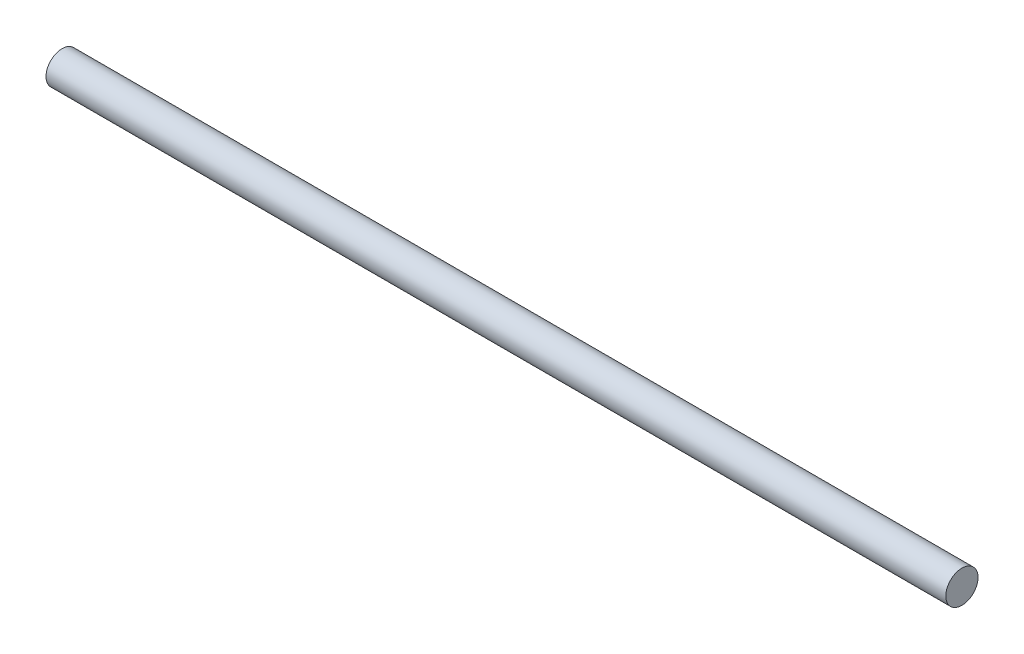
ISO-10303-21;
HEADER;
FILE_DESCRIPTION(('STEP AP214'),'2;1');
FILE_NAME('part.step','',(''),(''),'','','');
FILE_SCHEMA(('AUTOMOTIVE_DESIGN { 1 0 10303 214 1 1 1 1 }'));
ENDSEC;
DATA;
#1=APPLICATION_CONTEXT('core data for automotive mechanical design processes');
#2=APPLICATION_PROTOCOL_DEFINITION('international standard','automotive_design',2000,#1);
#3=PRODUCT_CONTEXT('',#1,'mechanical');
#4=PRODUCT('Part','Part','',(#3));
#5=PRODUCT_RELATED_PRODUCT_CATEGORY('part','',(#4));
#6=PRODUCT_DEFINITION_FORMATION('','',#4);
#7=PRODUCT_DEFINITION_CONTEXT('part definition',#1,'design');
#8=PRODUCT_DEFINITION('design','',#6,#7);
#9=PRODUCT_DEFINITION_SHAPE('','',#8);
#10=(LENGTH_UNIT() NAMED_UNIT(*) SI_UNIT(.MILLI.,.METRE.));
#11=(NAMED_UNIT(*) PLANE_ANGLE_UNIT() SI_UNIT($,.RADIAN.));
#12=(NAMED_UNIT(*) SI_UNIT($,.STERADIAN.) SOLID_ANGLE_UNIT());
#13=UNCERTAINTY_MEASURE_WITH_UNIT(LENGTH_MEASURE(1.E-05),#10,'distance_accuracy_value','');
#14=(GEOMETRIC_REPRESENTATION_CONTEXT(3) GLOBAL_UNCERTAINTY_ASSIGNED_CONTEXT((#13)) GLOBAL_UNIT_ASSIGNED_CONTEXT((#10,
#11,#12)) REPRESENTATION_CONTEXT('',''));
#15=CARTESIAN_POINT('',(0.,0.,0.));
#16=DIRECTION('',(0.,0.,1.));
#17=DIRECTION('',(1.,0.,0.));
#18=AXIS2_PLACEMENT_3D('',#15,#16,#17);
#19=CARTESIAN_POINT('',(304.8,0.,0.));
#20=DIRECTION('',(-1.,0.,0.));
#21=DIRECTION('',(0.,0.,1.));
#22=AXIS2_PLACEMENT_3D('',#19,#20,#21);
#23=CYLINDRICAL_SURFACE('',#22,5.461);
#24=CARTESIAN_POINT('',(304.8,0.,0.));
#25=DIRECTION('',(1.,0.,0.));
#26=DIRECTION('',(0.,0.,-1.));
#27=AXIS2_PLACEMENT_3D('',#24,#25,#26);
#28=CIRCLE('',#27,5.461);
#29=CARTESIAN_POINT('',(304.8,0.,5.461));
#30=VERTEX_POINT('',#29);
#31=EDGE_CURVE('E10',#30,#30,#28,.T.);
#32=CARTESIAN_POINT('',(0.,0.,0.));
#33=DIRECTION('',(1.,0.,0.));
#34=DIRECTION('',(0.,0.,-1.));
#35=AXIS2_PLACEMENT_3D('',#32,#33,#34);
#36=CIRCLE('',#35,5.461);
#37=CARTESIAN_POINT('',(0.,0.,5.461));
#38=VERTEX_POINT('',#37);
#39=EDGE_CURVE('E40',#38,#38,#36,.T.);
#40=CARTESIAN_POINT('',(304.8,0.,5.461));
#41=CARTESIAN_POINT('',(301.625,0.,5.461));
#42=CARTESIAN_POINT('',(298.45,0.,5.461));
#43=CARTESIAN_POINT('',(292.1,0.,5.461));
#44=CARTESIAN_POINT('',(288.925,0.,5.461));
#45=CARTESIAN_POINT('',(282.575,0.,5.461));
#46=CARTESIAN_POINT('',(279.4,0.,5.461));
#47=CARTESIAN_POINT('',(273.05,0.,5.461));
#48=CARTESIAN_POINT('',(269.875,0.,5.461));
#49=CARTESIAN_POINT('',(263.525,0.,5.461));
#50=CARTESIAN_POINT('',(260.35,0.,5.461));
#51=CARTESIAN_POINT('',(254.,0.,5.461));
#52=CARTESIAN_POINT('',(250.825,0.,5.461));
#53=CARTESIAN_POINT('',(244.475,0.,5.461));
#54=CARTESIAN_POINT('',(241.3,0.,5.461));
#55=CARTESIAN_POINT('',(234.95,0.,5.461));
#56=CARTESIAN_POINT('',(231.775,0.,5.461));
#57=CARTESIAN_POINT('',(225.425,0.,5.461));
#58=CARTESIAN_POINT('',(222.25,0.,5.461));
#59=CARTESIAN_POINT('',(215.9,0.,5.461));
#60=CARTESIAN_POINT('',(212.725,0.,5.461));
#61=CARTESIAN_POINT('',(206.375,0.,5.461));
#62=CARTESIAN_POINT('',(203.2,0.,5.461));
#63=CARTESIAN_POINT('',(196.85,0.,5.461));
#64=CARTESIAN_POINT('',(193.675,0.,5.461));
#65=CARTESIAN_POINT('',(187.325,0.,5.461));
#66=CARTESIAN_POINT('',(184.15,0.,5.461));
#67=CARTESIAN_POINT('',(177.8,0.,5.461));
#68=CARTESIAN_POINT('',(174.625,0.,5.461));
#69=CARTESIAN_POINT('',(168.275,0.,5.461));
#70=CARTESIAN_POINT('',(165.1,0.,5.461));
#71=CARTESIAN_POINT('',(158.75,0.,5.461));
#72=CARTESIAN_POINT('',(155.575,0.,5.461));
#73=CARTESIAN_POINT('',(149.225,0.,5.461));
#74=CARTESIAN_POINT('',(146.05,0.,5.461));
#75=CARTESIAN_POINT('',(139.7,0.,5.461));
#76=CARTESIAN_POINT('',(136.525,0.,5.461));
#77=CARTESIAN_POINT('',(130.175,0.,5.461));
#78=CARTESIAN_POINT('',(127.,0.,5.461));
#79=CARTESIAN_POINT('',(120.65,0.,5.461));
#80=CARTESIAN_POINT('',(117.475,0.,5.461));
#81=CARTESIAN_POINT('',(111.125,0.,5.461));
#82=CARTESIAN_POINT('',(107.95,0.,5.461));
#83=CARTESIAN_POINT('',(101.6,0.,5.461));
#84=CARTESIAN_POINT('',(98.425,0.,5.461));
#85=CARTESIAN_POINT('',(92.075,0.,5.461));
#86=CARTESIAN_POINT('',(88.9,0.,5.461));
#87=CARTESIAN_POINT('',(82.55,0.,5.461));
#88=CARTESIAN_POINT('',(79.375,0.,5.461));
#89=CARTESIAN_POINT('',(73.025,0.,5.461));
#90=CARTESIAN_POINT('',(69.85,0.,5.461));
#91=CARTESIAN_POINT('',(63.5,0.,5.461));
#92=CARTESIAN_POINT('',(60.325,0.,5.461));
#93=CARTESIAN_POINT('',(53.975,0.,5.461));
#94=CARTESIAN_POINT('',(50.8,0.,5.461));
#95=CARTESIAN_POINT('',(44.45,0.,5.461));
#96=CARTESIAN_POINT('',(41.275,0.,5.461));
#97=CARTESIAN_POINT('',(34.925,0.,5.461));
#98=CARTESIAN_POINT('',(31.75,0.,5.461));
#99=CARTESIAN_POINT('',(25.4,0.,5.461));
#100=CARTESIAN_POINT('',(22.225,0.,5.461));
#101=CARTESIAN_POINT('',(15.875,0.,5.461));
#102=CARTESIAN_POINT('',(12.7,0.,5.461));
#103=CARTESIAN_POINT('',(6.35,0.,5.461));
#104=CARTESIAN_POINT('',(3.175,0.,5.461));
#105=CARTESIAN_POINT('',(0.,0.,5.461));
#106=B_SPLINE_CURVE_WITH_KNOTS('',3,(#40,#41,#42,#43,#44,#45,#46,#47,#48,#49,#50,#51,#52,#53,
#54,#55,#56,#57,#58,#59,#60,#61,#62,#63,#64,#65,#66,#67,#68,#69,#70,#71,#72,#73,#74,#75,#76,#77,
#78,#79,#80,#81,#82,#83,#84,#85,#86,#87,#88,#89,#90,#91,#92,#93,#94,#95,#96,#97,#98,#99,#100,
#101,#102,#103,#104,#105),.UNSPECIFIED.,.F.,.F.,(4,2,2,2,2,2,2,2,2,2,2,2,2,2,2,2,2,2,2,2,2,2,2,
2,2,2,2,2,2,2,2,2,4),(0.,9.52500000000001,19.05,28.575,38.1,47.625,57.15,66.675,76.2,
85.7250000000001,95.2500000000001,104.775,114.3,123.825,133.35,142.875,152.4,161.925,171.45,
180.975,190.5,200.025,209.55,219.075,228.6,238.125,247.65,257.175,266.7,276.225,285.75,295.275,
304.8),.UNSPECIFIED.);
#107=EDGE_CURVE('BSEAM37',#30,#38,#106,.T.);
#108=ORIENTED_EDGE('',*,*,#31,.F.);
#109=ORIENTED_EDGE('',*,*,#39,.T.);
#110=ORIENTED_EDGE('',*,*,#107,.T.);
#111=ORIENTED_EDGE('',*,*,#107,.F.);
#112=EDGE_LOOP('',(#108,#110,#109,#111));
#113=FACE_BOUND('',#112,.T.);
#114=ADVANCED_FACE('F37',(#113),#23,.T.);
#115=CARTESIAN_POINT('',(304.8,0.,0.));
#116=DIRECTION('',(1.,0.,0.));
#117=DIRECTION('',(0.,0.,-1.));
#118=AXIS2_PLACEMENT_3D('',#115,#116,#117);
#119=PLANE('',#118);
#120=ORIENTED_EDGE('',*,*,#31,.T.);
#121=EDGE_LOOP('',(#120));
#122=FACE_BOUND('',#121,.T.);
#123=ADVANCED_FACE('F54',(#122),#119,.T.);
#124=CARTESIAN_POINT('',(0.,0.,0.));
#125=DIRECTION('',(1.,0.,0.));
#126=DIRECTION('',(0.,0.,-1.));
#127=AXIS2_PLACEMENT_3D('',#124,#125,#126);
#128=PLANE('',#127);
#129=ORIENTED_EDGE('',*,*,#39,.F.);
#130=EDGE_LOOP('',(#129));
#131=FACE_BOUND('',#130,.T.);
#132=ADVANCED_FACE('F52',(#131),#128,.F.);
#133=CLOSED_SHELL('',(#114,#123,#132));
#134=MANIFOLD_SOLID_BREP('B2',#133);
#135=ADVANCED_BREP_SHAPE_REPRESENTATION('',(#18,#134),#14);
#136=SHAPE_DEFINITION_REPRESENTATION(#9,#135);
ENDSEC;
END-ISO-10303-21;
